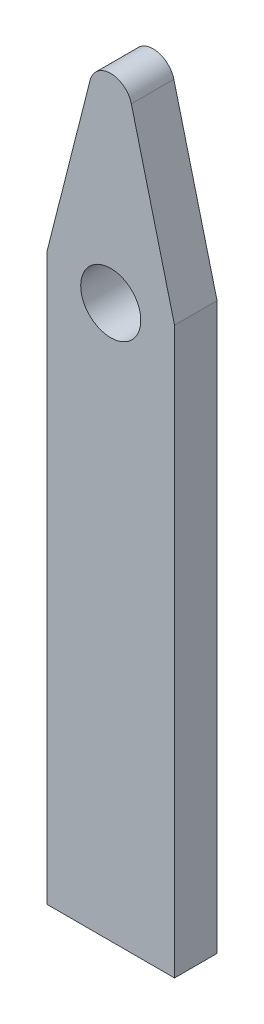
ISO-10303-21;
HEADER;
FILE_DESCRIPTION(('STEP AP214'),'2;1');
FILE_NAME('part.step','',(''),(''),'','','');
FILE_SCHEMA(('AUTOMOTIVE_DESIGN { 1 0 10303 214 1 1 1 1 }'));
ENDSEC;
DATA;
#1=APPLICATION_CONTEXT('core data for automotive mechanical design processes');
#2=APPLICATION_PROTOCOL_DEFINITION('international standard','automotive_design',2000,#1);
#3=PRODUCT_CONTEXT('',#1,'mechanical');
#4=PRODUCT('Part','Part','',(#3));
#5=PRODUCT_RELATED_PRODUCT_CATEGORY('part','',(#4));
#6=PRODUCT_DEFINITION_FORMATION('','',#4);
#7=PRODUCT_DEFINITION_CONTEXT('part definition',#1,'design');
#8=PRODUCT_DEFINITION('design','',#6,#7);
#9=PRODUCT_DEFINITION_SHAPE('','',#8);
#10=(LENGTH_UNIT() NAMED_UNIT(*) SI_UNIT(.MILLI.,.METRE.));
#11=(NAMED_UNIT(*) PLANE_ANGLE_UNIT() SI_UNIT($,.RADIAN.));
#12=(NAMED_UNIT(*) SI_UNIT($,.STERADIAN.) SOLID_ANGLE_UNIT());
#13=UNCERTAINTY_MEASURE_WITH_UNIT(LENGTH_MEASURE(1.E-05),#10,'distance_accuracy_value','');
#14=(GEOMETRIC_REPRESENTATION_CONTEXT(3) GLOBAL_UNCERTAINTY_ASSIGNED_CONTEXT((#13)) GLOBAL_UNIT_ASSIGNED_CONTEXT((#10,
#11,#12)) REPRESENTATION_CONTEXT('',''));
#15=CARTESIAN_POINT('',(0.,0.,0.));
#16=DIRECTION('',(0.,0.,1.));
#17=DIRECTION('',(1.,0.,0.));
#18=AXIS2_PLACEMENT_3D('',#15,#16,#17);
#19=CARTESIAN_POINT('',(-19.05,-117.222985708583,12.7));
#20=DIRECTION('',(1.,0.,0.));
#21=DIRECTION('',(0.,0.,-1.));
#22=AXIS2_PLACEMENT_3D('',#19,#20,#21);
#23=PLANE('',#22);
#24=DIRECTION('',(0.,-1.,0.));
#25=VECTOR('',#24,1.);
#26=CARTESIAN_POINT('',(-19.05,-117.222985708583,0.));
#27=LINE('',#26,#25);
#28=CARTESIAN_POINT('',(-19.05,51.6870142914172,0.));
#29=VERTEX_POINT('',#28);
#30=CARTESIAN_POINT('',(-19.05,-117.222985708583,0.));
#31=VERTEX_POINT('',#30);
#32=EDGE_CURVE('E119',#29,#31,#27,.T.);
#33=ORIENTED_EDGE('',*,*,#32,.T.);
#34=DIRECTION('',(0.,0.,-1.));
#35=VECTOR('',#34,1.);
#36=CARTESIAN_POINT('',(-19.05,-117.222985708583,12.7));
#37=LINE('',#36,#35);
#38=CARTESIAN_POINT('',(-19.05,-117.222985708583,12.7));
#39=VERTEX_POINT('',#38);
#40=EDGE_CURVE('E11',#39,#31,#37,.T.);
#41=ORIENTED_EDGE('',*,*,#40,.F.);
#42=DIRECTION('',(0.,-1.,0.));
#43=VECTOR('',#42,1.);
#44=CARTESIAN_POINT('',(-19.05,-117.222985708583,12.7));
#45=LINE('',#44,#43);
#46=CARTESIAN_POINT('',(-19.05,51.6870142914172,12.7));
#47=VERTEX_POINT('',#46);
#48=EDGE_CURVE('E130',#47,#39,#45,.T.);
#49=ORIENTED_EDGE('',*,*,#48,.F.);
#50=DIRECTION('',(0.,0.,-1.));
#51=VECTOR('',#50,1.);
#52=CARTESIAN_POINT('',(-19.05,51.6870142914172,12.7));
#53=LINE('',#52,#51);
#54=EDGE_CURVE('E115',#47,#29,#53,.T.);
#55=ORIENTED_EDGE('',*,*,#54,.T.);
#56=EDGE_LOOP('',(#33,#41,#49,#55));
#57=FACE_BOUND('',#56,.T.);
#58=ADVANCED_FACE('F35',(#57),#23,.F.);
#59=CARTESIAN_POINT('',(-19.05,-117.222985708583,12.7));
#60=DIRECTION('',(0.,1.,0.));
#61=DIRECTION('',(-1.,0.,0.));
#62=AXIS2_PLACEMENT_3D('',#59,#60,#61);
#63=PLANE('',#62);
#64=DIRECTION('',(1.,0.,0.));
#65=VECTOR('',#64,1.);
#66=CARTESIAN_POINT('',(-19.05,-117.222985708583,0.));
#67=LINE('',#66,#65);
#68=CARTESIAN_POINT('',(19.05,-117.222985708583,0.));
#69=VERTEX_POINT('',#68);
#70=EDGE_CURVE('E122',#31,#69,#67,.T.);
#71=ORIENTED_EDGE('',*,*,#70,.T.);
#72=DIRECTION('',(0.,0.,-1.));
#73=VECTOR('',#72,1.);
#74=CARTESIAN_POINT('',(19.05,-117.222985708583,12.7));
#75=LINE('',#74,#73);
#76=CARTESIAN_POINT('',(19.05,-117.222985708583,12.7));
#77=VERTEX_POINT('',#76);
#78=EDGE_CURVE('E43',#77,#69,#75,.T.);
#79=ORIENTED_EDGE('',*,*,#78,.F.);
#80=DIRECTION('',(1.,0.,0.));
#81=VECTOR('',#80,1.);
#82=CARTESIAN_POINT('',(-19.05,-117.222985708583,12.7));
#83=LINE('',#82,#81);
#84=EDGE_CURVE('E88',#39,#77,#83,.T.);
#85=ORIENTED_EDGE('',*,*,#84,.F.);
#86=ORIENTED_EDGE('',*,*,#40,.T.);
#87=EDGE_LOOP('',(#71,#79,#85,#86));
#88=FACE_BOUND('',#87,.T.);
#89=ADVANCED_FACE('F155',(#88),#63,.F.);
#90=CARTESIAN_POINT('',(19.05,-117.222985708583,12.7));
#91=DIRECTION('',(-1.,0.,0.));
#92=DIRECTION('',(0.,0.,1.));
#93=AXIS2_PLACEMENT_3D('',#90,#91,#92);
#94=PLANE('',#93);
#95=DIRECTION('',(0.,1.,0.));
#96=VECTOR('',#95,1.);
#97=CARTESIAN_POINT('',(19.05,-117.222985708583,0.));
#98=LINE('',#97,#96);
#99=CARTESIAN_POINT('',(19.05,51.6870142914172,0.));
#100=VERTEX_POINT('',#99);
#101=EDGE_CURVE('E125',#69,#100,#98,.T.);
#102=ORIENTED_EDGE('',*,*,#101,.T.);
#103=DIRECTION('',(0.,0.,-1.));
#104=VECTOR('',#103,1.);
#105=CARTESIAN_POINT('',(19.05,51.6870142914172,12.7));
#106=LINE('',#105,#104);
#107=CARTESIAN_POINT('',(19.05,51.6870142914172,12.7));
#108=VERTEX_POINT('',#107);
#109=EDGE_CURVE('E110',#108,#100,#106,.T.);
#110=ORIENTED_EDGE('',*,*,#109,.F.);
#111=DIRECTION('',(0.,1.,0.));
#112=VECTOR('',#111,1.);
#113=CARTESIAN_POINT('',(19.05,-117.222985708583,12.7));
#114=LINE('',#113,#112);
#115=EDGE_CURVE('E101',#77,#108,#114,.T.);
#116=ORIENTED_EDGE('',*,*,#115,.F.);
#117=ORIENTED_EDGE('',*,*,#78,.T.);
#118=EDGE_LOOP('',(#102,#110,#116,#117));
#119=FACE_BOUND('',#118,.T.);
#120=ADVANCED_FACE('F136',(#119),#94,.F.);
#121=CARTESIAN_POINT('',(19.05,51.6870142914172,12.7));
#122=DIRECTION('',(-0.969259837872207,-0.24603936003807,0.));
#123=DIRECTION('',(0.246039360038071,-0.969259837872207,0.));
#124=AXIS2_PLACEMENT_3D('',#121,#122,#123);
#125=PLANE('',#124);
#126=DIRECTION('',(-0.24603936003807,0.969259837872207,0.));
#127=VECTOR('',#126,1.);
#128=CARTESIAN_POINT('',(19.05,51.6870142914172,0.));
#129=LINE('',#128,#127);
#130=CARTESIAN_POINT('',(6.15479997048851,102.487014291417,0.));
#131=VERTEX_POINT('',#130);
#132=EDGE_CURVE('E109',#100,#131,#129,.T.);
#133=ORIENTED_EDGE('',*,*,#132,.T.);
#134=DIRECTION('',(0.,0.,-1.));
#135=VECTOR('',#134,1.);
#136=CARTESIAN_POINT('',(6.15479997048851,102.487014291417,12.7));
#137=LINE('',#136,#135);
#138=CARTESIAN_POINT('',(6.15479997048851,102.487014291417,12.7));
#139=VERTEX_POINT('',#138);
#140=EDGE_CURVE('E106',#139,#131,#137,.T.);
#141=ORIENTED_EDGE('',*,*,#140,.F.);
#142=DIRECTION('',(-0.24603936003807,0.969259837872207,0.));
#143=VECTOR('',#142,1.);
#144=CARTESIAN_POINT('',(19.05,51.6870142914172,12.7));
#145=LINE('',#144,#143);
#146=EDGE_CURVE('E95',#108,#139,#145,.T.);
#147=ORIENTED_EDGE('',*,*,#146,.F.);
#148=ORIENTED_EDGE('',*,*,#109,.T.);
#149=EDGE_LOOP('',(#133,#141,#147,#148));
#150=FACE_BOUND('',#149,.T.);
#151=ADVANCED_FACE('F107',(#150),#125,.F.);
#152=CARTESIAN_POINT('',(0.,100.924664355175,12.7));
#153=DIRECTION('',(0.,0.,-1.));
#154=DIRECTION('',(-1.,0.,0.));
#155=AXIS2_PLACEMENT_3D('',#152,#153,#154);
#156=CYLINDRICAL_SURFACE('',#155,6.35);
#157=CARTESIAN_POINT('',(0.,100.924664355175,0.));
#158=DIRECTION('',(0.,0.,1.));
#159=DIRECTION('',(1.,0.,0.));
#160=AXIS2_PLACEMENT_3D('',#157,#158,#159);
#161=CIRCLE('',#160,6.35);
#162=CARTESIAN_POINT('',(-6.15479997048852,102.487014291417,0.));
#163=VERTEX_POINT('',#162);
#164=EDGE_CURVE('E74',#131,#163,#161,.T.);
#165=ORIENTED_EDGE('',*,*,#164,.T.);
#166=DIRECTION('',(0.,0.,-1.));
#167=VECTOR('',#166,1.);
#168=CARTESIAN_POINT('',(-6.15479997048852,102.487014291417,12.7));
#169=LINE('',#168,#167);
#170=CARTESIAN_POINT('',(-6.15479997048852,102.487014291417,12.7));
#171=VERTEX_POINT('',#170);
#172=EDGE_CURVE('E111',#171,#163,#169,.T.);
#173=ORIENTED_EDGE('',*,*,#172,.F.);
#174=CARTESIAN_POINT('',(0.,100.924664355175,12.7));
#175=DIRECTION('',(0.,0.,1.));
#176=DIRECTION('',(1.,0.,0.));
#177=AXIS2_PLACEMENT_3D('',#174,#175,#176);
#178=CIRCLE('',#177,6.35);
#179=EDGE_CURVE('E99',#139,#171,#178,.T.);
#180=ORIENTED_EDGE('',*,*,#179,.F.);
#181=ORIENTED_EDGE('',*,*,#140,.T.);
#182=EDGE_LOOP('',(#165,#173,#180,#181));
#183=FACE_BOUND('',#182,.T.);
#184=ADVANCED_FACE('F113',(#183),#156,.T.);
#185=CARTESIAN_POINT('',(-6.15479997048851,102.487014291417,12.7));
#186=DIRECTION('',(0.969259837872207,-0.24603936003807,0.));
#187=DIRECTION('',(0.246039360038071,0.969259837872207,0.));
#188=AXIS2_PLACEMENT_3D('',#185,#186,#187);
#189=PLANE('',#188);
#190=DIRECTION('',(-0.24603936003807,-0.969259837872207,0.));
#191=VECTOR('',#190,1.);
#192=CARTESIAN_POINT('',(-6.15479997048851,102.487014291417,0.));
#193=LINE('',#192,#191);
#194=EDGE_CURVE('E80',#163,#29,#193,.T.);
#195=ORIENTED_EDGE('',*,*,#194,.T.);
#196=ORIENTED_EDGE('',*,*,#54,.F.);
#197=DIRECTION('',(-0.24603936003807,-0.969259837872207,0.));
#198=VECTOR('',#197,1.);
#199=CARTESIAN_POINT('',(-6.15479997048851,102.487014291417,12.7));
#200=LINE('',#199,#198);
#201=EDGE_CURVE('E51',#171,#47,#200,.T.);
#202=ORIENTED_EDGE('',*,*,#201,.F.);
#203=ORIENTED_EDGE('',*,*,#172,.T.);
#204=EDGE_LOOP('',(#195,#196,#202,#203));
#205=FACE_BOUND('',#204,.T.);
#206=ADVANCED_FACE('F143',(#205),#189,.F.);
#207=CARTESIAN_POINT('',(0.,100.924664355175,12.7));
#208=DIRECTION('',(0.,0.,1.));
#209=DIRECTION('',(1.,0.,0.));
#210=AXIS2_PLACEMENT_3D('',#207,#208,#209);
#211=PLANE('',#210);
#212=CARTESIAN_POINT('',(0.,47.8770142914172,12.7));
#213=DIRECTION('',(0.,0.,-1.));
#214=DIRECTION('',(-1.,0.,0.));
#215=AXIS2_PLACEMENT_3D('',#212,#213,#214);
#216=CIRCLE('',#215,8.97673988458217);
#217=CARTESIAN_POINT('',(-8.97673988458217,47.8770142914172,12.7));
#218=VERTEX_POINT('',#217);
#219=EDGE_CURVE('E123',#218,#218,#216,.T.);
#220=ORIENTED_EDGE('',*,*,#219,.T.);
#221=EDGE_LOOP('',(#220));
#222=FACE_BOUND('',#221,.T.);
#223=ORIENTED_EDGE('',*,*,#48,.T.);
#224=ORIENTED_EDGE('',*,*,#84,.T.);
#225=ORIENTED_EDGE('',*,*,#115,.T.);
#226=ORIENTED_EDGE('',*,*,#146,.T.);
#227=ORIENTED_EDGE('',*,*,#179,.T.);
#228=ORIENTED_EDGE('',*,*,#201,.T.);
#229=EDGE_LOOP('',(#223,#224,#225,#226,#227,#228));
#230=FACE_BOUND('',#229,.T.);
#231=ADVANCED_FACE('F97',(#222,#230),#211,.T.);
#232=CARTESIAN_POINT('',(0.,100.924664355175,0.));
#233=DIRECTION('',(0.,0.,1.));
#234=DIRECTION('',(1.,0.,0.));
#235=AXIS2_PLACEMENT_3D('',#232,#233,#234);
#236=PLANE('',#235);
#237=CARTESIAN_POINT('',(0.,47.8770142914172,0.));
#238=DIRECTION('',(0.,0.,-1.));
#239=DIRECTION('',(-1.,0.,0.));
#240=AXIS2_PLACEMENT_3D('',#237,#238,#239);
#241=CIRCLE('',#240,8.97673988458217);
#242=CARTESIAN_POINT('',(-8.97673988458217,47.8770142914172,0.));
#243=VERTEX_POINT('',#242);
#244=EDGE_CURVE('E210',#243,#243,#241,.T.);
#245=ORIENTED_EDGE('',*,*,#244,.F.);
#246=EDGE_LOOP('',(#245));
#247=FACE_BOUND('',#246,.T.);
#248=ORIENTED_EDGE('',*,*,#32,.F.);
#249=ORIENTED_EDGE('',*,*,#194,.F.);
#250=ORIENTED_EDGE('',*,*,#164,.F.);
#251=ORIENTED_EDGE('',*,*,#132,.F.);
#252=ORIENTED_EDGE('',*,*,#101,.F.);
#253=ORIENTED_EDGE('',*,*,#70,.F.);
#254=EDGE_LOOP('',(#248,#249,#250,#251,#252,#253));
#255=FACE_BOUND('',#254,.T.);
#256=ADVANCED_FACE('F139',(#247,#255),#236,.F.);
#257=CARTESIAN_POINT('',(0.,47.8770142914172,12.7));
#258=DIRECTION('',(0.,0.,-1.));
#259=DIRECTION('',(-1.,0.,0.));
#260=AXIS2_PLACEMENT_3D('',#257,#258,#259);
#261=CYLINDRICAL_SURFACE('',#260,8.97673988458217);
#262=ORIENTED_EDGE('',*,*,#219,.F.);
#263=EDGE_LOOP('',(#262));
#264=FACE_BOUND('',#263,.T.);
#265=ORIENTED_EDGE('',*,*,#244,.T.);
#266=EDGE_LOOP('',(#265));
#267=FACE_BOUND('',#266,.T.);
#268=ADVANCED_FACE('F192',(#264,#267),#261,.F.);
#269=CLOSED_SHELL('',(#58,#89,#120,#151,#184,#206,#231,#256,#268));
#270=MANIFOLD_SOLID_BREP('B2',#269);
#271=ADVANCED_BREP_SHAPE_REPRESENTATION('',(#18,#270),#14);
#272=SHAPE_DEFINITION_REPRESENTATION(#9,#271);
ENDSEC;
END-ISO-10303-21;
